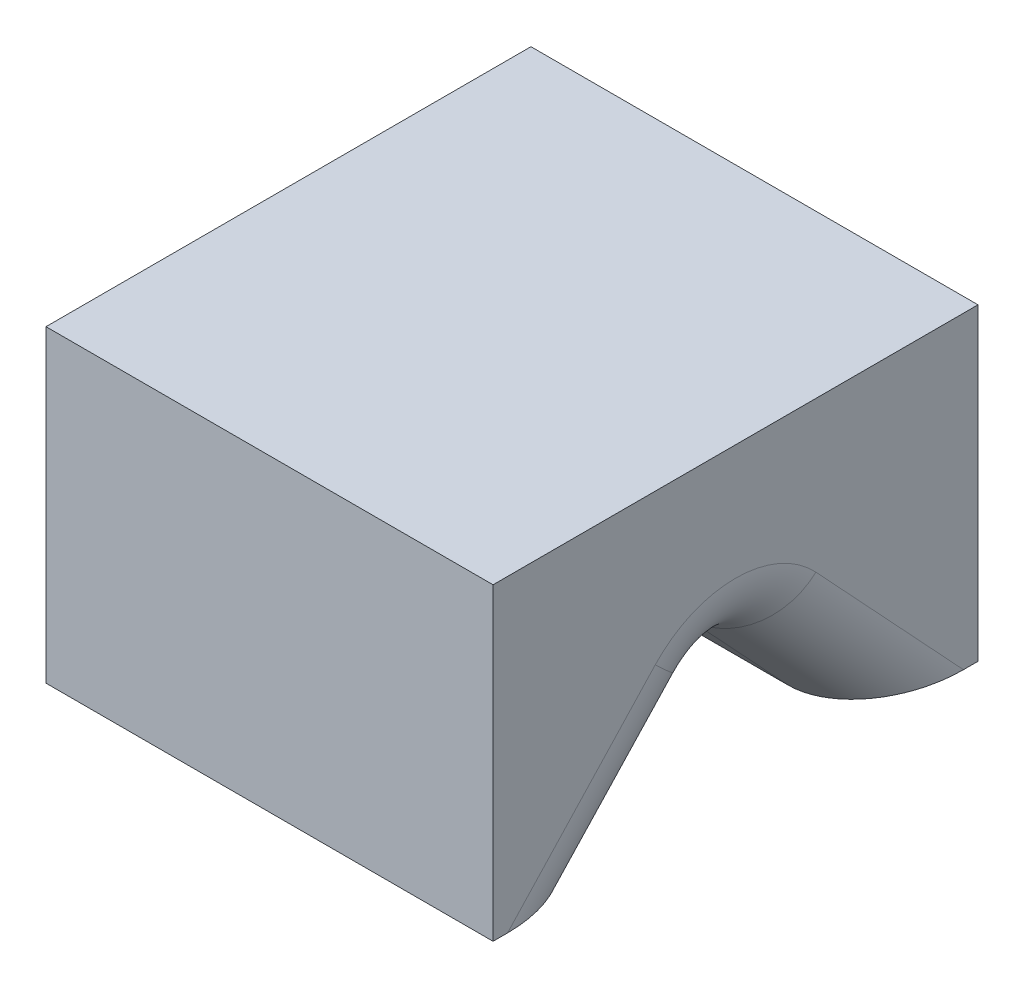
ISO-10303-21;
HEADER;
FILE_DESCRIPTION(('STEP AP214'),'2;1');
FILE_NAME('part.step','',(''),(''),'','','');
FILE_SCHEMA(('AUTOMOTIVE_DESIGN { 1 0 10303 214 1 1 1 1 }'));
ENDSEC;
DATA;
#1=APPLICATION_CONTEXT('core data for automotive mechanical design processes');
#2=APPLICATION_PROTOCOL_DEFINITION('international standard','automotive_design',2000,#1);
#3=PRODUCT_CONTEXT('',#1,'mechanical');
#4=PRODUCT('Part','Part','',(#3));
#5=PRODUCT_RELATED_PRODUCT_CATEGORY('part','',(#4));
#6=PRODUCT_DEFINITION_FORMATION('','',#4);
#7=PRODUCT_DEFINITION_CONTEXT('part definition',#1,'design');
#8=PRODUCT_DEFINITION('design','',#6,#7);
#9=PRODUCT_DEFINITION_SHAPE('','',#8);
#10=(LENGTH_UNIT() NAMED_UNIT(*) SI_UNIT(.MILLI.,.METRE.));
#11=(NAMED_UNIT(*) PLANE_ANGLE_UNIT() SI_UNIT($,.RADIAN.));
#12=(NAMED_UNIT(*) SI_UNIT($,.STERADIAN.) SOLID_ANGLE_UNIT());
#13=UNCERTAINTY_MEASURE_WITH_UNIT(LENGTH_MEASURE(1.E-05),#10,'distance_accuracy_value','');
#14=(GEOMETRIC_REPRESENTATION_CONTEXT(3) GLOBAL_UNCERTAINTY_ASSIGNED_CONTEXT((#13)) GLOBAL_UNIT_ASSIGNED_CONTEXT((#10,
#11,#12)) REPRESENTATION_CONTEXT('',''));
#15=CARTESIAN_POINT('',(0.,0.,0.));
#16=DIRECTION('',(0.,0.,1.));
#17=DIRECTION('',(1.,0.,0.));
#18=AXIS2_PLACEMENT_3D('',#15,#16,#17);
#19=CARTESIAN_POINT('',(0.,0.414017929910338,0.));
#20=DIRECTION('',(0.,1.,0.));
#21=DIRECTION('',(0.,0.,1.));
#22=AXIS2_PLACEMENT_3D('',#19,#20,#21);
#23=PLANE('',#22);
#24=DIRECTION('',(0.,0.,-1.));
#25=VECTOR('',#24,1.);
#26=CARTESIAN_POINT('',(-0.30226,0.414017929910338,1.50859998));
#27=LINE('',#26,#25);
#28=CARTESIAN_POINT('',(-0.30226,0.414017929910338,0.32512));
#29=VERTEX_POINT('',#28);
#30=CARTESIAN_POINT('',(-0.30226,0.414017929910338,-0.32512));
#31=VERTEX_POINT('',#30);
#32=EDGE_CURVE('E142',#29,#31,#27,.T.);
#33=ORIENTED_EDGE('',*,*,#32,.F.);
#34=DIRECTION('',(-1.,0.,0.));
#35=VECTOR('',#34,1.);
#36=CARTESIAN_POINT('',(1.50859998,0.414017929910338,0.32512));
#37=LINE('',#36,#35);
#38=CARTESIAN_POINT('',(0.29718,0.414017929910338,0.32512));
#39=VERTEX_POINT('',#38);
#40=EDGE_CURVE('E57',#39,#29,#37,.T.);
#41=ORIENTED_EDGE('',*,*,#40,.F.);
#42=DIRECTION('',(0.,0.,1.));
#43=VECTOR('',#42,1.);
#44=CARTESIAN_POINT('',(0.29718,0.414017929910338,1.50859998));
#45=LINE('',#44,#43);
#46=CARTESIAN_POINT('',(0.29718,0.414017929910338,-0.32512));
#47=VERTEX_POINT('',#46);
#48=EDGE_CURVE('E12',#47,#39,#45,.T.);
#49=ORIENTED_EDGE('',*,*,#48,.F.);
#50=DIRECTION('',(1.,0.,0.));
#51=VECTOR('',#50,1.);
#52=CARTESIAN_POINT('',(1.50859998,0.414017929910338,-0.32512));
#53=LINE('',#52,#51);
#54=EDGE_CURVE('E128',#31,#47,#53,.T.);
#55=ORIENTED_EDGE('',*,*,#54,.F.);
#56=EDGE_LOOP('',(#33,#41,#49,#55));
#57=FACE_BOUND('',#56,.T.);
#58=ADVANCED_FACE('F42',(#57),#23,.T.);
#59=CARTESIAN_POINT('',(1.50859998,-0.00999998000000009,-0.32512));
#60=DIRECTION('',(0.,0.,-1.));
#61=DIRECTION('',(-1.,0.,0.));
#62=AXIS2_PLACEMENT_3D('',#59,#60,#61);
#63=PLANE('',#62);
#64=DIRECTION('',(0.,1.,0.));
#65=VECTOR('',#64,1.);
#66=CARTESIAN_POINT('',(-0.30226,-0.00999998000000031,-0.32512));
#67=LINE('',#66,#65);
#68=CARTESIAN_POINT('',(-0.30226,0.,-0.32512));
#69=VERTEX_POINT('',#68);
#70=EDGE_CURVE('E141',#69,#31,#67,.T.);
#71=ORIENTED_EDGE('',*,*,#70,.T.);
#72=ORIENTED_EDGE('',*,*,#54,.T.);
#73=DIRECTION('',(0.,-1.,0.));
#74=VECTOR('',#73,1.);
#75=CARTESIAN_POINT('',(0.29718,-0.00999998000000002,-0.32512));
#76=LINE('',#75,#74);
#77=CARTESIAN_POINT('',(0.29718,0.,-0.32512));
#78=VERTEX_POINT('',#77);
#79=EDGE_CURVE('E138',#47,#78,#76,.T.);
#80=ORIENTED_EDGE('',*,*,#79,.T.);
#81=DIRECTION('',(-1.,0.,0.));
#82=VECTOR('',#81,1.);
#83=CARTESIAN_POINT('',(1.50859998,0.,-0.32512));
#84=LINE('',#83,#82);
#85=EDGE_CURVE('E330',#78,#69,#84,.T.);
#86=ORIENTED_EDGE('',*,*,#85,.T.);
#87=EDGE_LOOP('',(#71,#72,#80,#86));
#88=FACE_BOUND('',#87,.T.);
#89=ADVANCED_FACE('F136',(#88),#63,.T.);
#90=CARTESIAN_POINT('',(1.50859998,-0.00999998000000009,0.32512));
#91=DIRECTION('',(0.,0.,1.));
#92=DIRECTION('',(1.,0.,0.));
#93=AXIS2_PLACEMENT_3D('',#90,#91,#92);
#94=PLANE('',#93);
#95=DIRECTION('',(0.,1.,0.));
#96=VECTOR('',#95,1.);
#97=CARTESIAN_POINT('',(0.29718,-0.00999998000000002,0.32512));
#98=LINE('',#97,#96);
#99=CARTESIAN_POINT('',(0.29718,0.,0.32512));
#100=VERTEX_POINT('',#99);
#101=EDGE_CURVE('E168',#100,#39,#98,.T.);
#102=ORIENTED_EDGE('',*,*,#101,.T.);
#103=ORIENTED_EDGE('',*,*,#40,.T.);
#104=DIRECTION('',(0.,-1.,0.));
#105=VECTOR('',#104,1.);
#106=CARTESIAN_POINT('',(-0.30226,-0.00999998000000031,0.32512));
#107=LINE('',#106,#105);
#108=CARTESIAN_POINT('',(-0.30226,0.,0.32512));
#109=VERTEX_POINT('',#108);
#110=EDGE_CURVE('E148',#29,#109,#107,.T.);
#111=ORIENTED_EDGE('',*,*,#110,.T.);
#112=DIRECTION('',(-1.,0.,0.));
#113=VECTOR('',#112,1.);
#114=CARTESIAN_POINT('',(1.50859998,0.,0.32512));
#115=LINE('',#114,#113);
#116=EDGE_CURVE('E327',#100,#109,#115,.T.);
#117=ORIENTED_EDGE('',*,*,#116,.F.);
#118=EDGE_LOOP('',(#102,#103,#111,#117));
#119=FACE_BOUND('',#118,.T.);
#120=ADVANCED_FACE('F222',(#119),#94,.T.);
#121=CARTESIAN_POINT('',(-0.30226,0.88916002,1.50859998));
#122=DIRECTION('',(-1.,0.,0.));
#123=DIRECTION('',(0.,-1.,0.));
#124=AXIS2_PLACEMENT_3D('',#121,#122,#123);
#125=PLANE('',#124);
#126=ORIENTED_EDGE('',*,*,#110,.F.);
#127=ORIENTED_EDGE('',*,*,#32,.T.);
#128=ORIENTED_EDGE('',*,*,#70,.F.);
#129=DIRECTION('',(0.,0.,-1.));
#130=VECTOR('',#129,1.);
#131=CARTESIAN_POINT('',(-0.30226,0.,0.32512));
#132=LINE('',#131,#130);
#133=CARTESIAN_POINT('',(-0.30226,0.,-0.239665344323171));
#134=VERTEX_POINT('',#133);
#135=EDGE_CURVE('E150',#134,#69,#132,.T.);
#136=ORIENTED_EDGE('',*,*,#135,.F.);
#137=DIRECTION('',(0.,-0.731353701619172,-0.681998360062496));
#138=VECTOR('',#137,1.);
#139=CARTESIAN_POINT('',(-0.30226,0.179318757547791,-0.0724478976823951));
#140=LINE('',#139,#138);
#141=CARTESIAN_POINT('',(-0.30226,0.179318757547791,-0.0724478976823953));
#142=VERTEX_POINT('',#141);
#143=EDGE_CURVE('E299',#134,#142,#140,.F.);
#144=ORIENTED_EDGE('',*,*,#143,.T.);
#145=CARTESIAN_POINT('',(-0.30226,0.11176,0.));
#146=DIRECTION('',(-1.,0.,0.));
#147=DIRECTION('',(0.,-1.,0.));
#148=AXIS2_PLACEMENT_3D('',#145,#146,#147);
#149=CIRCLE('',#148,0.0990600000000001);
#150=CARTESIAN_POINT('',(-0.30226,0.179318757547791,0.0724478976823953));
#151=VERTEX_POINT('',#150);
#152=EDGE_CURVE('E293',#142,#151,#149,.F.);
#153=ORIENTED_EDGE('',*,*,#152,.T.);
#154=DIRECTION('',(0.,0.731353701619173,-0.681998360062496));
#155=VECTOR('',#154,1.);
#156=CARTESIAN_POINT('',(-0.30226,0.0346455166911749,0.207357877341616));
#157=LINE('',#156,#155);
#158=CARTESIAN_POINT('',(-0.30226,0.,0.239665344323171));
#159=VERTEX_POINT('',#158);
#160=EDGE_CURVE('E290',#151,#159,#157,.F.);
#161=ORIENTED_EDGE('',*,*,#160,.T.);
#162=EDGE_CURVE('E166',#109,#159,#132,.T.);
#163=ORIENTED_EDGE('',*,*,#162,.F.);
#164=EDGE_LOOP('',(#126,#127,#128,#136,#144,#153,#161,#163));
#165=FACE_BOUND('',#164,.T.);
#166=ADVANCED_FACE('F324',(#165),#125,.T.);
#167=CARTESIAN_POINT('',(0.29718,-0.00999998,1.50859998));
#168=DIRECTION('',(1.,0.,0.));
#169=DIRECTION('',(0.,1.,0.));
#170=AXIS2_PLACEMENT_3D('',#167,#168,#169);
#171=PLANE('',#170);
#172=ORIENTED_EDGE('',*,*,#79,.F.);
#173=ORIENTED_EDGE('',*,*,#48,.T.);
#174=ORIENTED_EDGE('',*,*,#101,.F.);
#175=DIRECTION('',(0.,0.,1.));
#176=VECTOR('',#175,1.);
#177=CARTESIAN_POINT('',(0.29718,0.,0.32512));
#178=LINE('',#177,#176);
#179=CARTESIAN_POINT('',(0.29718,0.,0.305652567595789));
#180=VERTEX_POINT('',#179);
#181=EDGE_CURVE('E152',#180,#100,#178,.T.);
#182=ORIENTED_EDGE('',*,*,#181,.F.);
#183=DIRECTION('',(0.,-0.731353701619173,0.681998360062496));
#184=VECTOR('',#183,1.);
#185=CARTESIAN_POINT('',(0.29718,0.212231998404407,0.107743027322537));
#186=LINE('',#185,#184);
#187=CARTESIAN_POINT('',(0.29718,0.212231998404407,0.107743027322537));
#188=VERTEX_POINT('',#187);
#189=EDGE_CURVE('E251',#180,#188,#186,.F.);
#190=ORIENTED_EDGE('',*,*,#189,.T.);
#191=CARTESIAN_POINT('',(0.29718,0.11176,0.));
#192=DIRECTION('',(1.,0.,0.));
#193=DIRECTION('',(0.,1.,0.));
#194=AXIS2_PLACEMENT_3D('',#191,#192,#193);
#195=CIRCLE('',#194,0.14732);
#196=CARTESIAN_POINT('',(0.29718,0.212231998404407,-0.107743027322537));
#197=VERTEX_POINT('',#196);
#198=EDGE_CURVE('E257',#188,#197,#195,.F.);
#199=ORIENTED_EDGE('',*,*,#198,.T.);
#200=DIRECTION('',(0.,0.731353701619172,0.681998360062496));
#201=VECTOR('',#200,1.);
#202=CARTESIAN_POINT('',(0.29718,0.0675587575477909,-0.242653006981758));
#203=LINE('',#202,#201);
#204=CARTESIAN_POINT('',(0.29718,0.,-0.305652567595789));
#205=VERTEX_POINT('',#204);
#206=EDGE_CURVE('E259',#197,#205,#203,.F.);
#207=ORIENTED_EDGE('',*,*,#206,.T.);
#208=EDGE_CURVE('E146',#78,#205,#178,.T.);
#209=ORIENTED_EDGE('',*,*,#208,.F.);
#210=EDGE_LOOP('',(#172,#173,#174,#182,#190,#199,#207,#209));
#211=FACE_BOUND('',#210,.T.);
#212=ADVANCED_FACE('F144',(#211),#171,.T.);
#213=CARTESIAN_POINT('',(0.,0.,0.));
#214=DIRECTION('',(0.,1.,0.));
#215=DIRECTION('',(0.,0.,1.));
#216=AXIS2_PLACEMENT_3D('',#213,#214,#215);
#217=PLANE('',#216);
#218=CARTESIAN_POINT('',(0.19812,0.,-0.170205109299363));
#219=DIRECTION('',(-1.,0.,0.));
#220=VECTOR('',#219,1.);
#221=LINE('',#218,#220);
#222=CARTESIAN_POINT('',(0.19812,0.,-0.170205109299363));
#223=VERTEX_POINT('',#222);
#224=CARTESIAN_POINT('',(-0.25146,0.,-0.170205109299363));
#225=VERTEX_POINT('',#224);
#226=EDGE_CURVE('E247',#223,#225,#221,.T.);
#227=ORIENTED_EDGE('',*,*,#226,.T.);
#228=CARTESIAN_POINT('',(-0.25146,0.,-0.239665344323171));
#229=DIRECTION('',(0.,1.,0.));
#230=DIRECTION('',(0.,0.,1.));
#231=AXIS2_PLACEMENT_3D('',#228,#229,#230);
#232=ELLIPSE('',#231,0.0694602350238085,0.0508);
#233=EDGE_CURVE('E286',#225,#134,#232,.F.);
#234=ORIENTED_EDGE('',*,*,#233,.T.);
#235=ORIENTED_EDGE('',*,*,#135,.T.);
#236=ORIENTED_EDGE('',*,*,#85,.F.);
#237=ORIENTED_EDGE('',*,*,#208,.T.);
#238=CARTESIAN_POINT('',(0.19812,0.,-0.305652567595789));
#239=DIRECTION('',(0.,1.,0.));
#240=DIRECTION('',(0.,0.,-1.));
#241=AXIS2_PLACEMENT_3D('',#238,#239,#240);
#242=ELLIPSE('',#241,0.135447458296426,0.09906);
#243=EDGE_CURVE('E261',#205,#223,#242,.F.);
#244=ORIENTED_EDGE('',*,*,#243,.T.);
#245=EDGE_LOOP('',(#227,#234,#235,#236,#237,#244));
#246=FACE_BOUND('',#245,.T.);
#247=ADVANCED_FACE('F190',(#246),#217,.F.);
#248=ORIENTED_EDGE('',*,*,#162,.T.);
#249=CARTESIAN_POINT('',(-0.25146,0.,0.239665344323171));
#250=DIRECTION('',(0.,1.,0.));
#251=DIRECTION('',(0.,0.,1.));
#252=AXIS2_PLACEMENT_3D('',#249,#250,#251);
#253=ELLIPSE('',#252,0.0694602350238084,0.0508);
#254=CARTESIAN_POINT('',(-0.25146,0.,0.170205109299363));
#255=VERTEX_POINT('',#254);
#256=EDGE_CURVE('E50',#159,#255,#253,.F.);
#257=ORIENTED_EDGE('',*,*,#256,.T.);
#258=CARTESIAN_POINT('',(-0.25146,0.,0.170205109299363));
#259=DIRECTION('',(1.,0.,0.));
#260=VECTOR('',#259,1.);
#261=LINE('',#258,#260);
#262=CARTESIAN_POINT('',(0.19812,0.,0.170205109299363));
#263=VERTEX_POINT('',#262);
#264=EDGE_CURVE('E304',#255,#263,#261,.T.);
#265=ORIENTED_EDGE('',*,*,#264,.T.);
#266=CARTESIAN_POINT('',(0.19812,0.,0.305652567595789));
#267=DIRECTION('',(0.,1.,0.));
#268=DIRECTION('',(0.,0.,-1.));
#269=AXIS2_PLACEMENT_3D('',#266,#267,#268);
#270=ELLIPSE('',#269,0.135447458296426,0.09906);
#271=EDGE_CURVE('E271',#263,#180,#270,.F.);
#272=ORIENTED_EDGE('',*,*,#271,.T.);
#273=ORIENTED_EDGE('',*,*,#181,.T.);
#274=ORIENTED_EDGE('',*,*,#116,.T.);
#275=EDGE_LOOP('',(#248,#257,#265,#272,#273,#274));
#276=FACE_BOUND('',#275,.T.);
#277=ADVANCED_FACE('F179',(#276),#217,.F.);
#278=CARTESIAN_POINT('',(-1.20142,0.144673240856616,-0.0352951296401414));
#279=DIRECTION('',(0.,0.681998360062496,-0.731353701619172));
#280=DIRECTION('',(0.,0.731353701619172,0.681998360062496));
#281=AXIS2_PLACEMENT_3D('',#278,#279,#280);
#282=PLANE('',#281);
#283=DIRECTION('',(1.,0.,0.));
#284=VECTOR('',#283,1.);
#285=CARTESIAN_POINT('',(-1.20142,0.144673240856616,-0.0352951296401414));
#286=LINE('',#285,#284);
#287=CARTESIAN_POINT('',(-0.25146,0.144673240856616,-0.0352951296401414));
#288=VERTEX_POINT('',#287);
#289=CARTESIAN_POINT('',(0.19812,0.144673240856616,-0.0352951296401414));
#290=VERTEX_POINT('',#289);
#291=EDGE_CURVE('E285',#288,#290,#286,.T.);
#292=ORIENTED_EDGE('',*,*,#291,.F.);
#293=DIRECTION('',(0.,-0.731353701619172,-0.681998360062496));
#294=VECTOR('',#293,1.);
#295=CARTESIAN_POINT('',(-0.25146,0.,-0.170205109299363));
#296=LINE('',#295,#294);
#297=EDGE_CURVE('E275',#288,#225,#296,.T.);
#298=ORIENTED_EDGE('',*,*,#297,.T.);
#299=ORIENTED_EDGE('',*,*,#226,.F.);
#300=DIRECTION('',(0.,0.731353701619172,0.681998360062496));
#301=VECTOR('',#300,1.);
#302=CARTESIAN_POINT('',(0.19812,0.144673240856616,-0.0352951296401413));
#303=LINE('',#302,#301);
#304=EDGE_CURVE('E249',#223,#290,#303,.T.);
#305=ORIENTED_EDGE('',*,*,#304,.T.);
#306=EDGE_LOOP('',(#292,#298,#299,#305));
#307=FACE_BOUND('',#306,.T.);
#308=ADVANCED_FACE('F189',(#307),#282,.F.);
#309=CARTESIAN_POINT('',(-1.20142,-0.00999998000000011,0.179530241510438));
#310=DIRECTION('',(0.,0.681998360062496,0.731353701619173));
#311=DIRECTION('',(0.,-0.731353701619173,0.681998360062496));
#312=AXIS2_PLACEMENT_3D('',#309,#310,#311);
#313=PLANE('',#312);
#314=ORIENTED_EDGE('',*,*,#264,.F.);
#315=DIRECTION('',(0.,0.731353701619173,-0.681998360062496));
#316=VECTOR('',#315,1.);
#317=CARTESIAN_POINT('',(-0.25146,0.144673240856616,0.0352951296401412));
#318=LINE('',#317,#316);
#319=CARTESIAN_POINT('',(-0.25146,0.144673240856616,0.0352951296401414));
#320=VERTEX_POINT('',#319);
#321=EDGE_CURVE('E302',#255,#320,#318,.T.);
#322=ORIENTED_EDGE('',*,*,#321,.T.);
#323=DIRECTION('',(1.,0.,0.));
#324=VECTOR('',#323,1.);
#325=CARTESIAN_POINT('',(-1.20142,0.144673240856616,0.0352951296401414));
#326=LINE('',#325,#324);
#327=CARTESIAN_POINT('',(0.19812,0.144673240856616,0.0352951296401414));
#328=VERTEX_POINT('',#327);
#329=EDGE_CURVE('E255',#320,#328,#326,.T.);
#330=ORIENTED_EDGE('',*,*,#329,.T.);
#331=DIRECTION('',(0.,-0.731353701619173,0.681998360062496));
#332=VECTOR('',#331,1.);
#333=CARTESIAN_POINT('',(0.19812,0.,0.170205109299363));
#334=LINE('',#333,#332);
#335=EDGE_CURVE('E268',#328,#263,#334,.T.);
#336=ORIENTED_EDGE('',*,*,#335,.T.);
#337=EDGE_LOOP('',(#314,#322,#330,#336));
#338=FACE_BOUND('',#337,.T.);
#339=ADVANCED_FACE('F227',(#338),#313,.F.);
#340=CARTESIAN_POINT('',(-1.20142,0.11176,0.));
#341=DIRECTION('',(1.,0.,0.));
#342=DIRECTION('',(0.,0.,-1.));
#343=AXIS2_PLACEMENT_3D('',#340,#341,#342);
#344=CYLINDRICAL_SURFACE('',#343,0.0482600000000002);
#345=ORIENTED_EDGE('',*,*,#329,.F.);
#346=CARTESIAN_POINT('',(-0.25146,0.11176,0.));
#347=DIRECTION('',(-1.,0.,0.));
#348=DIRECTION('',(0.,-1.,0.));
#349=AXIS2_PLACEMENT_3D('',#346,#347,#348);
#350=CIRCLE('',#349,0.0482600000000002);
#351=EDGE_CURVE('E301',#320,#288,#350,.T.);
#352=ORIENTED_EDGE('',*,*,#351,.T.);
#353=ORIENTED_EDGE('',*,*,#291,.T.);
#354=CARTESIAN_POINT('',(0.19812,0.11176,0.));
#355=DIRECTION('',(1.,0.,0.));
#356=DIRECTION('',(0.,1.,0.));
#357=AXIS2_PLACEMENT_3D('',#354,#355,#356);
#358=CIRCLE('',#357,0.0482600000000002);
#359=EDGE_CURVE('E263',#290,#328,#358,.T.);
#360=ORIENTED_EDGE('',*,*,#359,.T.);
#361=EDGE_LOOP('',(#345,#352,#353,#360));
#362=FACE_BOUND('',#361,.T.);
#363=ADVANCED_FACE('F204',(#362),#344,.F.);
#364=CARTESIAN_POINT('',(0.19812,0.0575587775477907,0.251978139192833));
#365=DIRECTION('',(0.,0.731353701619173,-0.681998360062496));
#366=DIRECTION('',(0.,0.681998360062496,0.731353701619173));
#367=AXIS2_PLACEMENT_3D('',#364,#365,#366);
#368=CYLINDRICAL_SURFACE('',#367,0.09906);
#369=ORIENTED_EDGE('',*,*,#271,.F.);
#370=ORIENTED_EDGE('',*,*,#335,.F.);
#371=CARTESIAN_POINT('',(0.19812,0.212231998404407,0.107743027322537));
#372=DIRECTION('',(0.,0.731353701619172,-0.681998360062497));
#373=DIRECTION('',(0.,0.681998360062497,0.731353701619172));
#374=AXIS2_PLACEMENT_3D('',#371,#372,#373);
#375=CIRCLE('',#374,0.09906);
#376=EDGE_CURVE('E281',#188,#328,#375,.T.);
#377=ORIENTED_EDGE('',*,*,#376,.F.);
#378=ORIENTED_EDGE('',*,*,#189,.F.);
#379=EDGE_LOOP('',(#369,#370,#377,#378));
#380=FACE_BOUND('',#379,.T.);
#381=ADVANCED_FACE('F200',(#380),#368,.T.);
#382=CARTESIAN_POINT('',(0.19812,0.11176,0.));
#383=DIRECTION('',(1.,0.,0.));
#384=DIRECTION('',(0.,1.,0.));
#385=AXIS2_PLACEMENT_3D('',#382,#383,#384);
#386=TOROIDAL_SURFACE('',#385,0.14732,0.09906);
#387=ORIENTED_EDGE('',*,*,#376,.T.);
#388=ORIENTED_EDGE('',*,*,#359,.F.);
#389=CARTESIAN_POINT('',(0.19812,0.212231998404407,-0.107743027322537));
#390=DIRECTION('',(0.,-0.731353701619172,-0.681998360062496));
#391=DIRECTION('',(0.,0.681998360062496,-0.731353701619172));
#392=AXIS2_PLACEMENT_3D('',#389,#390,#391);
#393=CIRCLE('',#392,0.09906);
#394=EDGE_CURVE('E278',#197,#290,#393,.T.);
#395=ORIENTED_EDGE('',*,*,#394,.F.);
#396=ORIENTED_EDGE('',*,*,#198,.F.);
#397=EDGE_LOOP('',(#387,#388,#395,#396));
#398=FACE_BOUND('',#397,.T.);
#399=ADVANCED_FACE('F196',(#398),#386,.T.);
#400=CARTESIAN_POINT('',(0.19812,0.212231998404407,-0.107743027322537));
#401=DIRECTION('',(0.,-0.731353701619172,-0.681998360062496));
#402=DIRECTION('',(0.,0.681998360062496,-0.731353701619172));
#403=AXIS2_PLACEMENT_3D('',#400,#401,#402);
#404=CYLINDRICAL_SURFACE('',#403,0.09906);
#405=ORIENTED_EDGE('',*,*,#243,.F.);
#406=ORIENTED_EDGE('',*,*,#206,.F.);
#407=ORIENTED_EDGE('',*,*,#394,.T.);
#408=ORIENTED_EDGE('',*,*,#304,.F.);
#409=EDGE_LOOP('',(#405,#406,#407,#408));
#410=FACE_BOUND('',#409,.T.);
#411=ADVANCED_FACE('F192',(#410),#404,.T.);
#412=CARTESIAN_POINT('',(-0.25146,0.0246455366911748,0.216683009552691));
#413=DIRECTION('',(0.,-0.731353701619173,0.681998360062496));
#414=DIRECTION('',(0.,-0.681998360062496,-0.731353701619173));
#415=AXIS2_PLACEMENT_3D('',#412,#413,#414);
#416=CYLINDRICAL_SURFACE('',#415,0.0508);
#417=ORIENTED_EDGE('',*,*,#256,.F.);
#418=ORIENTED_EDGE('',*,*,#160,.F.);
#419=CARTESIAN_POINT('',(-0.25146,0.179318757547791,0.0724478976823953));
#420=DIRECTION('',(0.,0.731353701619173,-0.681998360062496));
#421=DIRECTION('',(0.,0.681998360062496,0.731353701619173));
#422=AXIS2_PLACEMENT_3D('',#419,#420,#421);
#423=CIRCLE('',#422,0.0508);
#424=EDGE_CURVE('E282',#320,#151,#423,.T.);
#425=ORIENTED_EDGE('',*,*,#424,.F.);
#426=ORIENTED_EDGE('',*,*,#321,.F.);
#427=EDGE_LOOP('',(#417,#418,#425,#426));
#428=FACE_BOUND('',#427,.T.);
#429=ADVANCED_FACE('F44',(#428),#416,.T.);
#430=CARTESIAN_POINT('',(-0.25146,0.11176,0.));
#431=DIRECTION('',(-1.,0.,0.));
#432=DIRECTION('',(0.,-1.,0.));
#433=AXIS2_PLACEMENT_3D('',#430,#431,#432);
#434=TOROIDAL_SURFACE('',#433,0.0990600000000001,0.0508);
#435=ORIENTED_EDGE('',*,*,#424,.T.);
#436=ORIENTED_EDGE('',*,*,#152,.F.);
#437=CARTESIAN_POINT('',(-0.25146,0.179318757547791,-0.0724478976823953));
#438=DIRECTION('',(0.,-0.731353701619172,-0.681998360062497));
#439=DIRECTION('',(0.,0.681998360062497,-0.731353701619172));
#440=AXIS2_PLACEMENT_3D('',#437,#438,#439);
#441=CIRCLE('',#440,0.0508);
#442=EDGE_CURVE('E314',#288,#142,#441,.T.);
#443=ORIENTED_EDGE('',*,*,#442,.F.);
#444=ORIENTED_EDGE('',*,*,#351,.F.);
#445=EDGE_LOOP('',(#435,#436,#443,#444));
#446=FACE_BOUND('',#445,.T.);
#447=ADVANCED_FACE('F208',(#446),#434,.T.);
#448=CARTESIAN_POINT('',(-0.25146,0.179318757547791,-0.0724478976823953));
#449=DIRECTION('',(0.,0.731353701619172,0.681998360062496));
#450=DIRECTION('',(0.,-0.681998360062496,0.731353701619172));
#451=AXIS2_PLACEMENT_3D('',#448,#449,#450);
#452=CYLINDRICAL_SURFACE('',#451,0.0508);
#453=ORIENTED_EDGE('',*,*,#442,.T.);
#454=ORIENTED_EDGE('',*,*,#143,.F.);
#455=ORIENTED_EDGE('',*,*,#233,.F.);
#456=ORIENTED_EDGE('',*,*,#297,.F.);
#457=EDGE_LOOP('',(#453,#454,#455,#456));
#458=FACE_BOUND('',#457,.T.);
#459=ADVANCED_FACE('F206',(#458),#452,.T.);
#460=CLOSED_SHELL('',(#58,#89,#120,#166,#212,#247,#277,#308,#339,#363,#381,#399,#411,#429,#447,#459));
#461=MANIFOLD_SOLID_BREP('B2',#460);
#462=ADVANCED_BREP_SHAPE_REPRESENTATION('',(#18,#461),#14);
#463=SHAPE_DEFINITION_REPRESENTATION(#9,#462);
ENDSEC;
END-ISO-10303-21;
